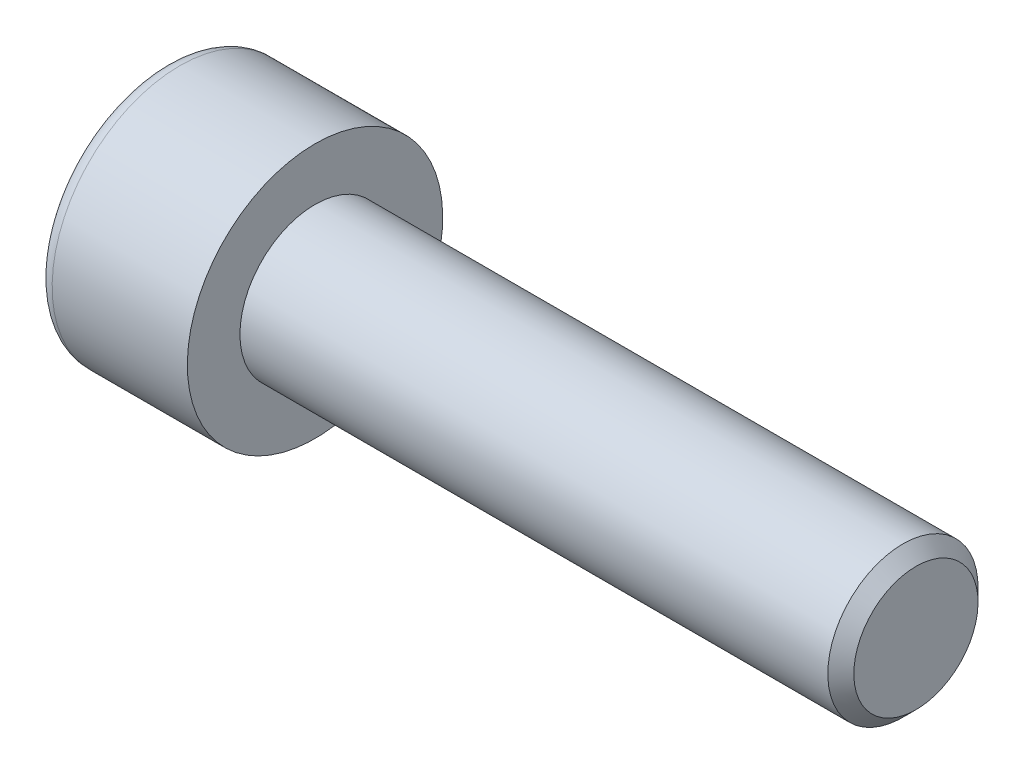
ISO-10303-21;
HEADER;
FILE_DESCRIPTION(('STEP AP214'),'2;1');
FILE_NAME('part.step','',(''),(''),'','','');
FILE_SCHEMA(('AUTOMOTIVE_DESIGN { 1 0 10303 214 1 1 1 1 }'));
ENDSEC;
DATA;
#1=APPLICATION_CONTEXT('core data for automotive mechanical design processes');
#2=APPLICATION_PROTOCOL_DEFINITION('international standard','automotive_design',2000,#1);
#3=PRODUCT_CONTEXT('',#1,'mechanical');
#4=PRODUCT('Part','Part','',(#3));
#5=PRODUCT_RELATED_PRODUCT_CATEGORY('part','',(#4));
#6=PRODUCT_DEFINITION_FORMATION('','',#4);
#7=PRODUCT_DEFINITION_CONTEXT('part definition',#1,'design');
#8=PRODUCT_DEFINITION('design','',#6,#7);
#9=PRODUCT_DEFINITION_SHAPE('','',#8);
#10=(LENGTH_UNIT() NAMED_UNIT(*) SI_UNIT(.MILLI.,.METRE.));
#11=(NAMED_UNIT(*) PLANE_ANGLE_UNIT() SI_UNIT($,.RADIAN.));
#12=(NAMED_UNIT(*) SI_UNIT($,.STERADIAN.) SOLID_ANGLE_UNIT());
#13=UNCERTAINTY_MEASURE_WITH_UNIT(LENGTH_MEASURE(1.E-05),#10,'distance_accuracy_value','');
#14=(GEOMETRIC_REPRESENTATION_CONTEXT(3) GLOBAL_UNCERTAINTY_ASSIGNED_CONTEXT((#13)) GLOBAL_UNIT_ASSIGNED_CONTEXT((#10,
#11,#12)) REPRESENTATION_CONTEXT('',''));
#15=CARTESIAN_POINT('',(0.,0.,0.));
#16=DIRECTION('',(0.,0.,1.));
#17=DIRECTION('',(1.,0.,0.));
#18=AXIS2_PLACEMENT_3D('',#15,#16,#17);
#19=CARTESIAN_POINT('',(0.,2.125,0.));
#20=DIRECTION('',(1.,0.,0.));
#21=DIRECTION('',(0.,1.,0.));
#22=AXIS2_PLACEMENT_3D('',#19,#20,#21);
#23=PLANE('',#22);
#24=CARTESIAN_POINT('',(0.,0.,0.));
#25=DIRECTION('',(1.,0.,0.));
#26=DIRECTION('',(0.,1.,0.));
#27=AXIS2_PLACEMENT_3D('',#24,#25,#26);
#28=CIRCLE('',#27,4.25);
#29=CARTESIAN_POINT('',(0.,4.25,0.));
#30=VERTEX_POINT('',#29);
#31=EDGE_CURVE('E11',#30,#30,#28,.T.);
#32=ORIENTED_EDGE('',*,*,#31,.T.);
#33=EDGE_LOOP('',(#32));
#34=FACE_BOUND('',#33,.T.);
#35=CARTESIAN_POINT('',(0.,0.,0.));
#36=DIRECTION('',(-1.,0.,0.));
#37=DIRECTION('',(0.,1.,0.));
#38=AXIS2_PLACEMENT_3D('',#35,#36,#37);
#39=CIRCLE('',#38,2.5);
#40=CARTESIAN_POINT('',(0.,-2.5,0.));
#41=VERTEX_POINT('',#40);
#42=EDGE_CURVE('E177',#41,#41,#39,.T.);
#43=ORIENTED_EDGE('',*,*,#42,.T.);
#44=EDGE_LOOP('',(#43));
#45=FACE_BOUND('',#44,.T.);
#46=ADVANCED_FACE('F17',(#34,#45),#23,.T.);
#47=CARTESIAN_POINT('',(-2.25,0.,0.));
#48=DIRECTION('',(-1.,0.,0.));
#49=DIRECTION('',(0.,1.,0.));
#50=AXIS2_PLACEMENT_3D('',#47,#48,#49);
#51=CYLINDRICAL_SURFACE('',#50,4.25);
#52=CARTESIAN_POINT('',(-4.5,0.,0.));
#53=DIRECTION('',(1.,0.,0.));
#54=DIRECTION('',(0.,1.,0.));
#55=AXIS2_PLACEMENT_3D('',#52,#53,#54);
#56=CIRCLE('',#55,4.25);
#57=CARTESIAN_POINT('',(-4.5,4.25,0.));
#58=VERTEX_POINT('',#57);
#59=EDGE_CURVE('E24',#58,#58,#56,.T.);
#60=ORIENTED_EDGE('',*,*,#59,.T.);
#61=EDGE_LOOP('',(#60));
#62=FACE_BOUND('',#61,.T.);
#63=ORIENTED_EDGE('',*,*,#31,.F.);
#64=EDGE_LOOP('',(#63));
#65=FACE_BOUND('',#64,.T.);
#66=ADVANCED_FACE('F170',(#62,#65),#51,.T.);
#67=CARTESIAN_POINT('',(-4.5,0.,0.));
#68=DIRECTION('',(1.,0.,0.));
#69=DIRECTION('',(0.,0.,-1.));
#70=AXIS2_PLACEMENT_3D('',#67,#68,#69);
#71=TOROIDAL_SURFACE('',#70,3.75,0.5);
#72=CARTESIAN_POINT('',(-5.,0.,0.));
#73=DIRECTION('',(1.,0.,0.));
#74=DIRECTION('',(0.,1.,0.));
#75=AXIS2_PLACEMENT_3D('',#72,#73,#74);
#76=CIRCLE('',#75,3.75);
#77=CARTESIAN_POINT('',(-5.,3.75,0.));
#78=VERTEX_POINT('',#77);
#79=EDGE_CURVE('E92',#78,#78,#76,.T.);
#80=ORIENTED_EDGE('',*,*,#79,.T.);
#81=EDGE_LOOP('',(#80));
#82=FACE_BOUND('',#81,.T.);
#83=ORIENTED_EDGE('',*,*,#59,.F.);
#84=EDGE_LOOP('',(#83));
#85=FACE_BOUND('',#84,.T.);
#86=ADVANCED_FACE('F115',(#82,#85),#71,.T.);
#87=CARTESIAN_POINT('',(-5.,1.875,0.));
#88=DIRECTION('',(-1.,0.,0.));
#89=DIRECTION('',(0.,-1.,0.));
#90=AXIS2_PLACEMENT_3D('',#87,#88,#89);
#91=PLANE('',#90);
#92=ORIENTED_EDGE('',*,*,#79,.F.);
#93=EDGE_LOOP('',(#92));
#94=FACE_BOUND('',#93,.T.);
#95=DIRECTION('',(0.,-0.5,-0.866025403784439));
#96=VECTOR('',#95,1.);
#97=CARTESIAN_POINT('',(-5.,-1.49767580756888,1.40594940802396));
#98=LINE('',#97,#96);
#99=CARTESIAN_POINT('',(-5.,-1.15470053837925,2.));
#100=VERTEX_POINT('',#99);
#101=CARTESIAN_POINT('',(-5.,-2.30940107675851,0.));
#102=VERTEX_POINT('',#101);
#103=EDGE_CURVE('E124',#100,#102,#98,.T.);
#104=ORIENTED_EDGE('',*,*,#103,.T.);
#105=DIRECTION('',(0.,0.5,-0.866025403784439));
#106=VECTOR('',#105,1.);
#107=CARTESIAN_POINT('',(-5.,-1.49767580756888,-1.40594940802396));
#108=LINE('',#107,#106);
#109=CARTESIAN_POINT('',(-5.,-1.15470053837925,-2.));
#110=VERTEX_POINT('',#109);
#111=EDGE_CURVE('E93',#102,#110,#108,.T.);
#112=ORIENTED_EDGE('',*,*,#111,.T.);
#113=DIRECTION('',(0.,1.,0.));
#114=VECTOR('',#113,1.);
#115=CARTESIAN_POINT('',(-5.,0.9375,-2.));
#116=LINE('',#115,#114);
#117=CARTESIAN_POINT('',(-5.,1.15470053837925,-2.));
#118=VERTEX_POINT('',#117);
#119=EDGE_CURVE('E105',#110,#118,#116,.T.);
#120=ORIENTED_EDGE('',*,*,#119,.T.);
#121=DIRECTION('',(0.,0.5,0.866025403784439));
#122=VECTOR('',#121,1.);
#123=CARTESIAN_POINT('',(-5.,1.96642580756887,-0.594050591976045));
#124=LINE('',#123,#122);
#125=CARTESIAN_POINT('',(-5.,2.30940107675851,0.));
#126=VERTEX_POINT('',#125);
#127=EDGE_CURVE('E137',#118,#126,#124,.T.);
#128=ORIENTED_EDGE('',*,*,#127,.T.);
#129=DIRECTION('',(0.,-0.5,0.866025403784439));
#130=VECTOR('',#129,1.);
#131=CARTESIAN_POINT('',(-5.,1.96642580756888,0.594050591976044));
#132=LINE('',#131,#130);
#133=CARTESIAN_POINT('',(-5.,1.15470053837925,2.));
#134=VERTEX_POINT('',#133);
#135=EDGE_CURVE('E145',#126,#134,#132,.T.);
#136=ORIENTED_EDGE('',*,*,#135,.T.);
#137=DIRECTION('',(0.,-1.,0.));
#138=VECTOR('',#137,1.);
#139=CARTESIAN_POINT('',(-5.,0.9375,2.));
#140=LINE('',#139,#138);
#141=EDGE_CURVE('E109',#134,#100,#140,.T.);
#142=ORIENTED_EDGE('',*,*,#141,.T.);
#143=EDGE_LOOP('',(#104,#112,#120,#128,#136,#142));
#144=FACE_BOUND('',#143,.T.);
#145=ADVANCED_FACE('F118',(#94,#144),#91,.T.);
#146=CARTESIAN_POINT('',(-2.5,0.,0.));
#147=DIRECTION('',(1.,0.,0.));
#148=DIRECTION('',(0.,0.,-1.));
#149=AXIS2_PLACEMENT_3D('',#146,#147,#148);
#150=PLANE('',#149);
#151=DIRECTION('',(0.,0.5,0.866025403784439));
#152=VECTOR('',#151,1.);
#153=CARTESIAN_POINT('',(-2.5,-1.15470053837925,2.));
#154=LINE('',#153,#152);
#155=CARTESIAN_POINT('',(-2.5,-2.30940107675851,0.));
#156=VERTEX_POINT('',#155);
#157=CARTESIAN_POINT('',(-2.5,-1.15470053837925,2.));
#158=VERTEX_POINT('',#157);
#159=EDGE_CURVE('E129',#156,#158,#154,.T.);
#160=ORIENTED_EDGE('',*,*,#159,.T.);
#161=DIRECTION('',(0.,1.,0.));
#162=VECTOR('',#161,1.);
#163=CARTESIAN_POINT('',(-2.5,1.15470053837925,2.));
#164=LINE('',#163,#162);
#165=CARTESIAN_POINT('',(-2.5,1.15470053837925,2.));
#166=VERTEX_POINT('',#165);
#167=EDGE_CURVE('E133',#158,#166,#164,.T.);
#168=ORIENTED_EDGE('',*,*,#167,.T.);
#169=DIRECTION('',(0.,0.5,-0.866025403784439));
#170=VECTOR('',#169,1.);
#171=CARTESIAN_POINT('',(-2.5,2.30940107675851,0.));
#172=LINE('',#171,#170);
#173=CARTESIAN_POINT('',(-2.5,2.30940107675851,0.));
#174=VERTEX_POINT('',#173);
#175=EDGE_CURVE('E147',#166,#174,#172,.T.);
#176=ORIENTED_EDGE('',*,*,#175,.T.);
#177=DIRECTION('',(0.,-0.5,-0.866025403784439));
#178=VECTOR('',#177,1.);
#179=CARTESIAN_POINT('',(-2.5,1.15470053837925,-2.));
#180=LINE('',#179,#178);
#181=CARTESIAN_POINT('',(-2.5,1.15470053837925,-2.));
#182=VERTEX_POINT('',#181);
#183=EDGE_CURVE('E99',#174,#182,#180,.T.);
#184=ORIENTED_EDGE('',*,*,#183,.T.);
#185=DIRECTION('',(0.,-1.,0.));
#186=VECTOR('',#185,1.);
#187=CARTESIAN_POINT('',(-2.5,-1.15470053837925,-2.));
#188=LINE('',#187,#186);
#189=CARTESIAN_POINT('',(-2.5,-1.15470053837925,-2.));
#190=VERTEX_POINT('',#189);
#191=EDGE_CURVE('E96',#182,#190,#188,.T.);
#192=ORIENTED_EDGE('',*,*,#191,.T.);
#193=DIRECTION('',(0.,-0.5,0.866025403784439));
#194=VECTOR('',#193,1.);
#195=CARTESIAN_POINT('',(-2.5,-2.30940107675851,0.));
#196=LINE('',#195,#194);
#197=EDGE_CURVE('E82',#190,#156,#196,.T.);
#198=ORIENTED_EDGE('',*,*,#197,.T.);
#199=EDGE_LOOP('',(#160,#168,#176,#184,#192,#198));
#200=FACE_BOUND('',#199,.T.);
#201=ADVANCED_FACE('F97',(#200),#150,.F.);
#202=CARTESIAN_POINT('',(-6.,-1.73205080756887,-1.));
#203=DIRECTION('',(0.,-0.866025403784439,-0.5));
#204=DIRECTION('',(0.,0.5,-0.866025403784439));
#205=AXIS2_PLACEMENT_3D('',#202,#203,#204);
#206=PLANE('',#205);
#207=ORIENTED_EDGE('',*,*,#111,.F.);
#208=DIRECTION('',(1.,0.,0.));
#209=VECTOR('',#208,1.);
#210=CARTESIAN_POINT('',(-6.,-2.30940107675851,0.));
#211=LINE('',#210,#209);
#212=EDGE_CURVE('E89',#102,#156,#211,.T.);
#213=ORIENTED_EDGE('',*,*,#212,.T.);
#214=ORIENTED_EDGE('',*,*,#197,.F.);
#215=DIRECTION('',(1.,0.,0.));
#216=VECTOR('',#215,1.);
#217=CARTESIAN_POINT('',(-6.,-1.15470053837925,-2.));
#218=LINE('',#217,#216);
#219=EDGE_CURVE('E86',#110,#190,#218,.T.);
#220=ORIENTED_EDGE('',*,*,#219,.F.);
#221=EDGE_LOOP('',(#207,#213,#214,#220));
#222=FACE_BOUND('',#221,.T.);
#223=ADVANCED_FACE('F84',(#222),#206,.F.);
#224=CARTESIAN_POINT('',(-6.,0.,-2.));
#225=DIRECTION('',(0.,0.,-1.));
#226=DIRECTION('',(0.,1.,0.));
#227=AXIS2_PLACEMENT_3D('',#224,#225,#226);
#228=PLANE('',#227);
#229=ORIENTED_EDGE('',*,*,#119,.F.);
#230=ORIENTED_EDGE('',*,*,#219,.T.);
#231=ORIENTED_EDGE('',*,*,#191,.F.);
#232=DIRECTION('',(1.,0.,0.));
#233=VECTOR('',#232,1.);
#234=CARTESIAN_POINT('',(-6.,1.15470053837925,-2.));
#235=LINE('',#234,#233);
#236=EDGE_CURVE('E138',#118,#182,#235,.T.);
#237=ORIENTED_EDGE('',*,*,#236,.F.);
#238=EDGE_LOOP('',(#229,#230,#231,#237));
#239=FACE_BOUND('',#238,.T.);
#240=ADVANCED_FACE('F104',(#239),#228,.F.);
#241=CARTESIAN_POINT('',(-6.,-1.73205080756887,1.));
#242=DIRECTION('',(0.,-0.866025403784439,0.5));
#243=DIRECTION('',(0.,-0.5,-0.866025403784439));
#244=AXIS2_PLACEMENT_3D('',#241,#242,#243);
#245=PLANE('',#244);
#246=ORIENTED_EDGE('',*,*,#103,.F.);
#247=DIRECTION('',(1.,0.,0.));
#248=VECTOR('',#247,1.);
#249=CARTESIAN_POINT('',(-6.,-1.15470053837925,2.));
#250=LINE('',#249,#248);
#251=EDGE_CURVE('E130',#100,#158,#250,.T.);
#252=ORIENTED_EDGE('',*,*,#251,.T.);
#253=ORIENTED_EDGE('',*,*,#159,.F.);
#254=ORIENTED_EDGE('',*,*,#212,.F.);
#255=EDGE_LOOP('',(#246,#252,#253,#254));
#256=FACE_BOUND('',#255,.T.);
#257=ADVANCED_FACE('F159',(#256),#245,.F.);
#258=CARTESIAN_POINT('',(-6.,0.,2.));
#259=DIRECTION('',(0.,0.,1.));
#260=DIRECTION('',(0.,-1.,0.));
#261=AXIS2_PLACEMENT_3D('',#258,#259,#260);
#262=PLANE('',#261);
#263=ORIENTED_EDGE('',*,*,#141,.F.);
#264=DIRECTION('',(1.,0.,0.));
#265=VECTOR('',#264,1.);
#266=CARTESIAN_POINT('',(-6.,1.15470053837925,2.));
#267=LINE('',#266,#265);
#268=EDGE_CURVE('E149',#134,#166,#267,.T.);
#269=ORIENTED_EDGE('',*,*,#268,.T.);
#270=ORIENTED_EDGE('',*,*,#167,.F.);
#271=ORIENTED_EDGE('',*,*,#251,.F.);
#272=EDGE_LOOP('',(#263,#269,#270,#271));
#273=FACE_BOUND('',#272,.T.);
#274=ADVANCED_FACE('F155',(#273),#262,.F.);
#275=CARTESIAN_POINT('',(-6.,1.73205080756888,1.));
#276=DIRECTION('',(0.,0.866025403784439,0.5));
#277=DIRECTION('',(0.,-0.5,0.866025403784439));
#278=AXIS2_PLACEMENT_3D('',#275,#276,#277);
#279=PLANE('',#278);
#280=ORIENTED_EDGE('',*,*,#135,.F.);
#281=DIRECTION('',(1.,0.,0.));
#282=VECTOR('',#281,1.);
#283=CARTESIAN_POINT('',(-6.,2.30940107675851,0.));
#284=LINE('',#283,#282);
#285=EDGE_CURVE('E141',#126,#174,#284,.T.);
#286=ORIENTED_EDGE('',*,*,#285,.T.);
#287=ORIENTED_EDGE('',*,*,#175,.F.);
#288=ORIENTED_EDGE('',*,*,#268,.F.);
#289=EDGE_LOOP('',(#280,#286,#287,#288));
#290=FACE_BOUND('',#289,.T.);
#291=ADVANCED_FACE('F157',(#290),#279,.F.);
#292=CARTESIAN_POINT('',(-6.,1.73205080756887,-1.));
#293=DIRECTION('',(0.,0.866025403784439,-0.5));
#294=DIRECTION('',(0.,0.5,0.866025403784439));
#295=AXIS2_PLACEMENT_3D('',#292,#293,#294);
#296=PLANE('',#295);
#297=ORIENTED_EDGE('',*,*,#127,.F.);
#298=ORIENTED_EDGE('',*,*,#236,.T.);
#299=ORIENTED_EDGE('',*,*,#183,.F.);
#300=ORIENTED_EDGE('',*,*,#285,.F.);
#301=EDGE_LOOP('',(#297,#298,#299,#300));
#302=FACE_BOUND('',#301,.T.);
#303=ADVANCED_FACE('F201',(#302),#296,.F.);
#304=CARTESIAN_POINT('',(20.,1.0335,0.));
#305=DIRECTION('',(1.,0.,0.));
#306=DIRECTION('',(0.,1.,0.));
#307=AXIS2_PLACEMENT_3D('',#304,#305,#306);
#308=PLANE('',#307);
#309=CARTESIAN_POINT('',(20.,0.,0.));
#310=DIRECTION('',(1.,0.,0.));
#311=DIRECTION('',(0.,1.,0.));
#312=AXIS2_PLACEMENT_3D('',#309,#310,#311);
#313=CIRCLE('',#312,2.067);
#314=CARTESIAN_POINT('',(20.,2.067,0.));
#315=VERTEX_POINT('',#314);
#316=EDGE_CURVE('E179',#315,#315,#313,.T.);
#317=ORIENTED_EDGE('',*,*,#316,.T.);
#318=EDGE_LOOP('',(#317));
#319=FACE_BOUND('',#318,.T.);
#320=ADVANCED_FACE('F196',(#319),#308,.T.);
#321=CARTESIAN_POINT('',(19.7835,0.,0.));
#322=DIRECTION('',(-1.,0.,0.));
#323=DIRECTION('',(0.,1.,0.));
#324=AXIS2_PLACEMENT_3D('',#321,#322,#323);
#325=CONICAL_SURFACE('',#324,2.2835,0.785398163397448);
#326=CARTESIAN_POINT('',(19.567,0.,0.));
#327=DIRECTION('',(1.,0.,0.));
#328=DIRECTION('',(0.,1.,0.));
#329=AXIS2_PLACEMENT_3D('',#326,#327,#328);
#330=CIRCLE('',#329,2.5);
#331=CARTESIAN_POINT('',(19.567,2.5,0.));
#332=VERTEX_POINT('',#331);
#333=EDGE_CURVE('E180',#332,#332,#330,.T.);
#334=ORIENTED_EDGE('',*,*,#333,.T.);
#335=EDGE_LOOP('',(#334));
#336=FACE_BOUND('',#335,.T.);
#337=ORIENTED_EDGE('',*,*,#316,.F.);
#338=EDGE_LOOP('',(#337));
#339=FACE_BOUND('',#338,.T.);
#340=ADVANCED_FACE('F186',(#336,#339),#325,.T.);
#341=CARTESIAN_POINT('',(9.5335,0.,0.));
#342=DIRECTION('',(-1.,0.,0.));
#343=DIRECTION('',(0.,1.,0.));
#344=AXIS2_PLACEMENT_3D('',#341,#342,#343);
#345=CYLINDRICAL_SURFACE('',#344,2.5);
#346=ORIENTED_EDGE('',*,*,#42,.F.);
#347=EDGE_LOOP('',(#346));
#348=FACE_BOUND('',#347,.T.);
#349=ORIENTED_EDGE('',*,*,#333,.F.);
#350=EDGE_LOOP('',(#349));
#351=FACE_BOUND('',#350,.T.);
#352=ADVANCED_FACE('F189',(#348,#351),#345,.T.);
#353=CLOSED_SHELL('',(#46,#66,#86,#145,#201,#223,#240,#257,#274,#291,#303,#320,#340,#352));
#354=MANIFOLD_SOLID_BREP('B1',#353);
#355=ADVANCED_BREP_SHAPE_REPRESENTATION('',(#18,#354),#14);
#356=SHAPE_DEFINITION_REPRESENTATION(#9,#355);
ENDSEC;
END-ISO-10303-21;
